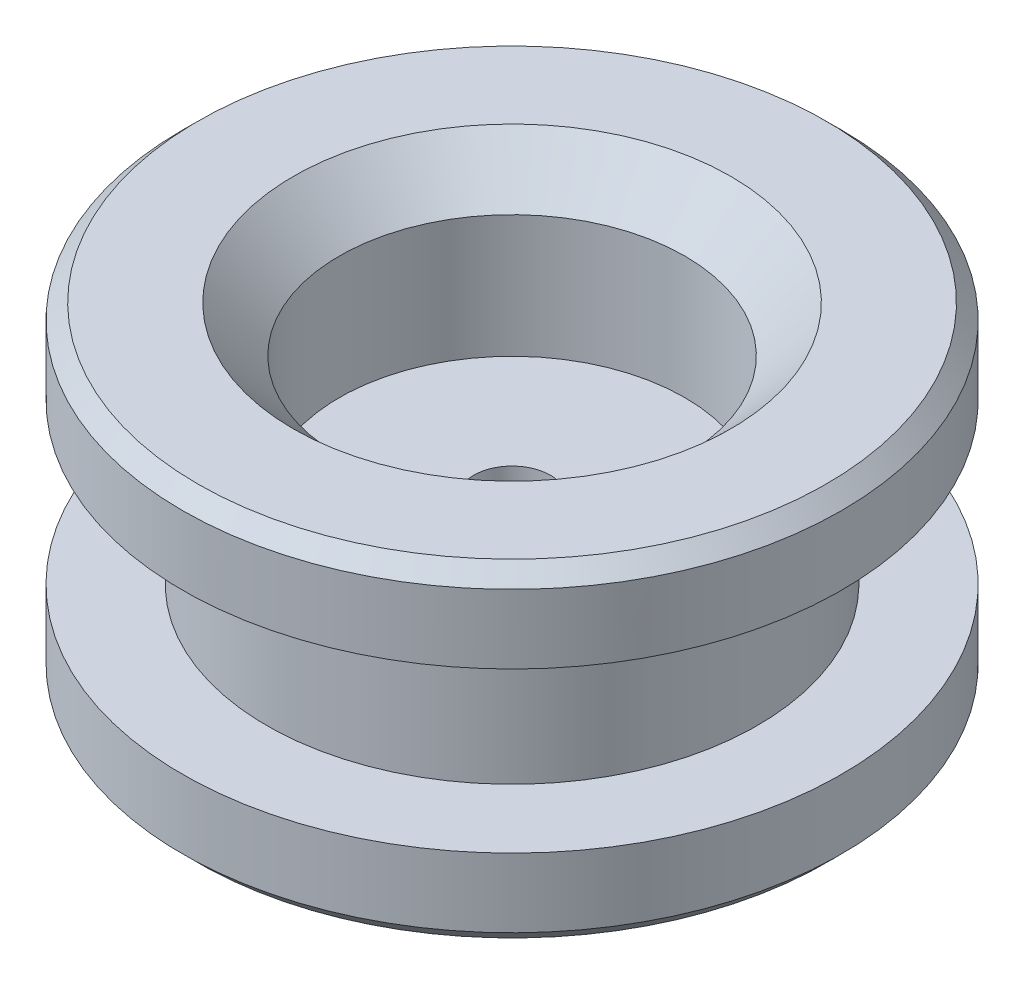
ISO-10303-21;
HEADER;
FILE_DESCRIPTION(('STEP AP214'),'2;1');
FILE_NAME('part.step','',(''),(''),'','','');
FILE_SCHEMA(('AUTOMOTIVE_DESIGN { 1 0 10303 214 1 1 1 1 }'));
ENDSEC;
DATA;
#1=APPLICATION_CONTEXT('core data for automotive mechanical design processes');
#2=APPLICATION_PROTOCOL_DEFINITION('international standard','automotive_design',2000,#1);
#3=PRODUCT_CONTEXT('',#1,'mechanical');
#4=PRODUCT('Part','Part','',(#3));
#5=PRODUCT_RELATED_PRODUCT_CATEGORY('part','',(#4));
#6=PRODUCT_DEFINITION_FORMATION('','',#4);
#7=PRODUCT_DEFINITION_CONTEXT('part definition',#1,'design');
#8=PRODUCT_DEFINITION('design','',#6,#7);
#9=PRODUCT_DEFINITION_SHAPE('','',#8);
#10=(LENGTH_UNIT() NAMED_UNIT(*) SI_UNIT(.MILLI.,.METRE.));
#11=(NAMED_UNIT(*) PLANE_ANGLE_UNIT() SI_UNIT($,.RADIAN.));
#12=(NAMED_UNIT(*) SI_UNIT($,.STERADIAN.) SOLID_ANGLE_UNIT());
#13=UNCERTAINTY_MEASURE_WITH_UNIT(LENGTH_MEASURE(1.E-05),#10,'distance_accuracy_value','');
#14=(GEOMETRIC_REPRESENTATION_CONTEXT(3) GLOBAL_UNCERTAINTY_ASSIGNED_CONTEXT((#13)) GLOBAL_UNIT_ASSIGNED_CONTEXT((#10,
#11,#12)) REPRESENTATION_CONTEXT('',''));
#15=CARTESIAN_POINT('',(0.,0.,0.));
#16=DIRECTION('',(0.,0.,1.));
#17=DIRECTION('',(1.,0.,0.));
#18=AXIS2_PLACEMENT_3D('',#15,#16,#17);
#19=CARTESIAN_POINT('',(0.,0.,0.));
#20=DIRECTION('',(0.,-1.,0.));
#21=DIRECTION('',(0.,0.,-1.));
#22=AXIS2_PLACEMENT_3D('',#19,#20,#21);
#23=CYLINDRICAL_SURFACE('',#22,2.5);
#24=CARTESIAN_POINT('',(0.,30.1454863379495,0.));
#25=DIRECTION('',(0.,-1.,0.));
#26=DIRECTION('',(0.,0.,-1.));
#27=AXIS2_PLACEMENT_3D('',#24,#25,#26);
#28=CIRCLE('',#27,2.5);
#29=CARTESIAN_POINT('',(0.,30.1454863379495,-2.5));
#30=VERTEX_POINT('',#29);
#31=EDGE_CURVE('E68',#30,#30,#28,.T.);
#32=ORIENTED_EDGE('',*,*,#31,.T.);
#33=EDGE_LOOP('',(#32));
#34=FACE_BOUND('',#33,.T.);
#35=CARTESIAN_POINT('',(0.,40.5454863379495,0.));
#36=DIRECTION('',(0.,-1.,0.));
#37=DIRECTION('',(0.,0.,-1.));
#38=AXIS2_PLACEMENT_3D('',#35,#36,#37);
#39=CIRCLE('',#38,2.5);
#40=CARTESIAN_POINT('',(0.,40.5454863379495,-2.5));
#41=VERTEX_POINT('',#40);
#42=EDGE_CURVE('E91',#41,#41,#39,.T.);
#43=ORIENTED_EDGE('',*,*,#42,.F.);
#44=EDGE_LOOP('',(#43));
#45=FACE_BOUND('',#44,.T.);
#46=ADVANCED_FACE('F35',(#34,#45),#23,.F.);
#47=CARTESIAN_POINT('',(2.5,30.1454863379495,0.));
#48=DIRECTION('',(0.,-1.,0.));
#49=DIRECTION('',(0.,0.,-1.));
#50=AXIS2_PLACEMENT_3D('',#47,#48,#49);
#51=PLANE('',#50);
#52=CARTESIAN_POINT('',(0.,30.1454863379495,0.));
#53=DIRECTION('',(0.,-1.,0.));
#54=DIRECTION('',(0.,0.,-1.));
#55=AXIS2_PLACEMENT_3D('',#52,#53,#54);
#56=CIRCLE('',#55,20.5);
#57=CARTESIAN_POINT('',(0.,30.1454863379495,-20.5));
#58=VERTEX_POINT('',#57);
#59=EDGE_CURVE('E55',#58,#58,#56,.T.);
#60=ORIENTED_EDGE('',*,*,#59,.T.);
#61=EDGE_LOOP('',(#60));
#62=FACE_BOUND('',#61,.T.);
#63=ORIENTED_EDGE('',*,*,#31,.F.);
#64=EDGE_LOOP('',(#63));
#65=FACE_BOUND('',#64,.T.);
#66=ADVANCED_FACE('F100',(#62,#65),#51,.T.);
#67=CARTESIAN_POINT('',(0.,0.,0.));
#68=DIRECTION('',(0.,-1.,0.));
#69=DIRECTION('',(0.,0.,-1.));
#70=AXIS2_PLACEMENT_3D('',#67,#68,#69);
#71=CYLINDRICAL_SURFACE('',#70,21.5);
#72=CARTESIAN_POINT('',(0.,31.1454863379496,0.));
#73=DIRECTION('',(0.,-1.,0.));
#74=DIRECTION('',(0.,0.,-1.));
#75=AXIS2_PLACEMENT_3D('',#72,#73,#74);
#76=CIRCLE('',#75,21.5);
#77=CARTESIAN_POINT('',(0.,31.1454863379496,-21.5));
#78=VERTEX_POINT('',#77);
#79=EDGE_CURVE('E49',#78,#78,#76,.F.);
#80=ORIENTED_EDGE('',*,*,#79,.T.);
#81=EDGE_LOOP('',(#80));
#82=FACE_BOUND('',#81,.T.);
#83=CARTESIAN_POINT('',(0.,35.6454863379495,0.));
#84=DIRECTION('',(0.,-1.,0.));
#85=DIRECTION('',(0.,0.,-1.));
#86=AXIS2_PLACEMENT_3D('',#83,#84,#85);
#87=CIRCLE('',#86,21.5);
#88=CARTESIAN_POINT('',(0.,35.6454863379495,-21.5));
#89=VERTEX_POINT('',#88);
#90=EDGE_CURVE('E72',#89,#89,#87,.T.);
#91=ORIENTED_EDGE('',*,*,#90,.T.);
#92=EDGE_LOOP('',(#91));
#93=FACE_BOUND('',#92,.T.);
#94=ADVANCED_FACE('F106',(#82,#93),#71,.T.);
#95=CARTESIAN_POINT('',(16.,35.6454863379495,0.));
#96=DIRECTION('',(0.,1.,0.));
#97=DIRECTION('',(0.,0.,1.));
#98=AXIS2_PLACEMENT_3D('',#95,#96,#97);
#99=PLANE('',#98);
#100=CARTESIAN_POINT('',(0.,35.6454863379495,0.));
#101=DIRECTION('',(0.,-1.,0.));
#102=DIRECTION('',(0.,0.,-1.));
#103=AXIS2_PLACEMENT_3D('',#100,#101,#102);
#104=CIRCLE('',#103,16.);
#105=CARTESIAN_POINT('',(0.,35.6454863379495,-16.));
#106=VERTEX_POINT('',#105);
#107=EDGE_CURVE('E75',#106,#106,#104,.T.);
#108=ORIENTED_EDGE('',*,*,#107,.T.);
#109=EDGE_LOOP('',(#108));
#110=FACE_BOUND('',#109,.T.);
#111=ORIENTED_EDGE('',*,*,#90,.F.);
#112=EDGE_LOOP('',(#111));
#113=FACE_BOUND('',#112,.T.);
#114=ADVANCED_FACE('F129',(#110,#113),#99,.T.);
#115=CARTESIAN_POINT('',(0.,0.,0.));
#116=DIRECTION('',(0.,-1.,0.));
#117=DIRECTION('',(0.,0.,-1.));
#118=AXIS2_PLACEMENT_3D('',#115,#116,#117);
#119=CYLINDRICAL_SURFACE('',#118,16.);
#120=CARTESIAN_POINT('',(0.,46.0454863379495,0.));
#121=DIRECTION('',(0.,-1.,0.));
#122=DIRECTION('',(0.,0.,-1.));
#123=AXIS2_PLACEMENT_3D('',#120,#121,#122);
#124=CIRCLE('',#123,16.);
#125=CARTESIAN_POINT('',(0.,46.0454863379495,-16.));
#126=VERTEX_POINT('',#125);
#127=EDGE_CURVE('E79',#126,#126,#124,.T.);
#128=ORIENTED_EDGE('',*,*,#127,.T.);
#129=EDGE_LOOP('',(#128));
#130=FACE_BOUND('',#129,.T.);
#131=ORIENTED_EDGE('',*,*,#107,.F.);
#132=EDGE_LOOP('',(#131));
#133=FACE_BOUND('',#132,.T.);
#134=ADVANCED_FACE('F133',(#130,#133),#119,.T.);
#135=CARTESIAN_POINT('',(21.5,46.0454863379495,0.));
#136=DIRECTION('',(0.,-1.,0.));
#137=DIRECTION('',(0.,0.,-1.));
#138=AXIS2_PLACEMENT_3D('',#135,#136,#137);
#139=PLANE('',#138);
#140=CARTESIAN_POINT('',(0.,46.0454863379495,0.));
#141=DIRECTION('',(0.,-1.,0.));
#142=DIRECTION('',(0.,0.,-1.));
#143=AXIS2_PLACEMENT_3D('',#140,#141,#142);
#144=CIRCLE('',#143,21.5);
#145=CARTESIAN_POINT('',(0.,46.0454863379495,-21.5));
#146=VERTEX_POINT('',#145);
#147=EDGE_CURVE('E83',#146,#146,#144,.T.);
#148=ORIENTED_EDGE('',*,*,#147,.T.);
#149=EDGE_LOOP('',(#148));
#150=FACE_BOUND('',#149,.T.);
#151=ORIENTED_EDGE('',*,*,#127,.F.);
#152=EDGE_LOOP('',(#151));
#153=FACE_BOUND('',#152,.T.);
#154=ADVANCED_FACE('F139',(#150,#153),#139,.T.);
#155=CARTESIAN_POINT('',(0.,0.,0.));
#156=DIRECTION('',(0.,-1.,0.));
#157=DIRECTION('',(0.,0.,-1.));
#158=AXIS2_PLACEMENT_3D('',#155,#156,#157);
#159=CYLINDRICAL_SURFACE('',#158,21.5);
#160=CARTESIAN_POINT('',(0.,50.5454863379495,0.));
#161=DIRECTION('',(0.,1.,0.));
#162=DIRECTION('',(0.,0.,1.));
#163=AXIS2_PLACEMENT_3D('',#160,#161,#162);
#164=CIRCLE('',#163,21.5);
#165=CARTESIAN_POINT('',(0.,50.5454863379495,21.5));
#166=VERTEX_POINT('',#165);
#167=EDGE_CURVE('E43',#166,#166,#164,.F.);
#168=ORIENTED_EDGE('',*,*,#167,.T.);
#169=EDGE_LOOP('',(#168));
#170=FACE_BOUND('',#169,.T.);
#171=ORIENTED_EDGE('',*,*,#147,.F.);
#172=EDGE_LOOP('',(#171));
#173=FACE_BOUND('',#172,.T.);
#174=ADVANCED_FACE('F145',(#170,#173),#159,.T.);
#175=CARTESIAN_POINT('',(11.269263070513,51.5454863379495,0.));
#176=DIRECTION('',(0.,1.,0.));
#177=DIRECTION('',(0.,0.,1.));
#178=AXIS2_PLACEMENT_3D('',#175,#176,#177);
#179=PLANE('',#178);
#180=CARTESIAN_POINT('',(0.,51.5454863379495,0.));
#181=DIRECTION('',(0.,1.,0.));
#182=DIRECTION('',(0.,0.,1.));
#183=AXIS2_PLACEMENT_3D('',#180,#181,#182);
#184=CIRCLE('',#183,20.5);
#185=CARTESIAN_POINT('',(0.,51.5454863379495,20.5));
#186=VERTEX_POINT('',#185);
#187=EDGE_CURVE('E10',#186,#186,#184,.T.);
#188=ORIENTED_EDGE('',*,*,#187,.T.);
#189=EDGE_LOOP('',(#188));
#190=FACE_BOUND('',#189,.T.);
#191=CARTESIAN_POINT('',(0.,51.5454863379495,0.));
#192=DIRECTION('',(0.,1.,0.));
#193=DIRECTION('',(0.,0.,1.));
#194=AXIS2_PLACEMENT_3D('',#191,#192,#193);
#195=CIRCLE('',#194,14.269263070513);
#196=CARTESIAN_POINT('',(0.,51.5454863379495,14.269263070513));
#197=VERTEX_POINT('',#196);
#198=EDGE_CURVE('E64',#197,#197,#195,.F.);
#199=ORIENTED_EDGE('',*,*,#198,.T.);
#200=EDGE_LOOP('',(#199));
#201=FACE_BOUND('',#200,.T.);
#202=ADVANCED_FACE('F149',(#190,#201),#179,.T.);
#203=CARTESIAN_POINT('',(0.,0.,0.));
#204=DIRECTION('',(0.,-1.,0.));
#205=DIRECTION('',(0.,0.,-1.));
#206=AXIS2_PLACEMENT_3D('',#203,#204,#205);
#207=CYLINDRICAL_SURFACE('',#206,11.269263070513);
#208=CARTESIAN_POINT('',(0.,48.5454863379495,0.));
#209=DIRECTION('',(0.,1.,0.));
#210=DIRECTION('',(0.,0.,1.));
#211=AXIS2_PLACEMENT_3D('',#208,#209,#210);
#212=CIRCLE('',#211,11.269263070513);
#213=CARTESIAN_POINT('',(0.,48.5454863379495,11.269263070513));
#214=VERTEX_POINT('',#213);
#215=EDGE_CURVE('E60',#214,#214,#212,.T.);
#216=ORIENTED_EDGE('',*,*,#215,.T.);
#217=EDGE_LOOP('',(#216));
#218=FACE_BOUND('',#217,.T.);
#219=CARTESIAN_POINT('',(0.,40.5454863379495,0.));
#220=DIRECTION('',(0.,-1.,0.));
#221=DIRECTION('',(0.,0.,-1.));
#222=AXIS2_PLACEMENT_3D('',#219,#220,#221);
#223=CIRCLE('',#222,11.269263070513);
#224=CARTESIAN_POINT('',(0.,40.5454863379495,-11.269263070513));
#225=VERTEX_POINT('',#224);
#226=EDGE_CURVE('E87',#225,#225,#223,.T.);
#227=ORIENTED_EDGE('',*,*,#226,.T.);
#228=EDGE_LOOP('',(#227));
#229=FACE_BOUND('',#228,.T.);
#230=ADVANCED_FACE('F152',(#218,#229),#207,.F.);
#231=CARTESIAN_POINT('',(2.5,40.5454863379495,0.));
#232=DIRECTION('',(0.,1.,0.));
#233=DIRECTION('',(0.,0.,1.));
#234=AXIS2_PLACEMENT_3D('',#231,#232,#233);
#235=PLANE('',#234);
#236=ORIENTED_EDGE('',*,*,#42,.T.);
#237=EDGE_LOOP('',(#236));
#238=FACE_BOUND('',#237,.T.);
#239=ORIENTED_EDGE('',*,*,#226,.F.);
#240=EDGE_LOOP('',(#239));
#241=FACE_BOUND('',#240,.T.);
#242=ADVANCED_FACE('F96',(#238,#241),#235,.T.);
#243=CARTESIAN_POINT('',(0.,51.5454863379495,0.));
#244=DIRECTION('',(0.,1.,0.));
#245=DIRECTION('',(0.,0.,1.));
#246=AXIS2_PLACEMENT_3D('',#243,#244,#245);
#247=CONICAL_SURFACE('',#246,14.269263070513,0.785398163397447);
#248=ORIENTED_EDGE('',*,*,#215,.F.);
#249=EDGE_LOOP('',(#248));
#250=FACE_BOUND('',#249,.T.);
#251=ORIENTED_EDGE('',*,*,#198,.F.);
#252=EDGE_LOOP('',(#251));
#253=FACE_BOUND('',#252,.T.);
#254=ADVANCED_FACE('F111',(#250,#253),#247,.F.);
#255=CARTESIAN_POINT('',(0.,30.1454863379495,0.));
#256=DIRECTION('',(0.,1.,0.));
#257=DIRECTION('',(0.,0.,1.));
#258=AXIS2_PLACEMENT_3D('',#255,#256,#257);
#259=CONICAL_SURFACE('',#258,20.5,0.78539816339745);
#260=ORIENTED_EDGE('',*,*,#79,.F.);
#261=EDGE_LOOP('',(#260));
#262=FACE_BOUND('',#261,.T.);
#263=ORIENTED_EDGE('',*,*,#59,.F.);
#264=EDGE_LOOP('',(#263));
#265=FACE_BOUND('',#264,.T.);
#266=ADVANCED_FACE('F113',(#262,#265),#259,.T.);
#267=CARTESIAN_POINT('',(0.,50.5454863379495,0.));
#268=DIRECTION('',(0.,-1.,0.));
#269=DIRECTION('',(0.,0.,-1.));
#270=AXIS2_PLACEMENT_3D('',#267,#268,#269);
#271=CONICAL_SURFACE('',#270,21.5,0.78539816339745);
#272=ORIENTED_EDGE('',*,*,#187,.F.);
#273=EDGE_LOOP('',(#272));
#274=FACE_BOUND('',#273,.T.);
#275=ORIENTED_EDGE('',*,*,#167,.F.);
#276=EDGE_LOOP('',(#275));
#277=FACE_BOUND('',#276,.T.);
#278=ADVANCED_FACE('F37',(#274,#277),#271,.T.);
#279=CLOSED_SHELL('',(#46,#66,#94,#114,#134,#154,#174,#202,#230,#242,#254,#266,#278));
#280=MANIFOLD_SOLID_BREP('B2',#279);
#281=ADVANCED_BREP_SHAPE_REPRESENTATION('',(#18,#280),#14);
#282=SHAPE_DEFINITION_REPRESENTATION(#9,#281);
ENDSEC;
END-ISO-10303-21;
